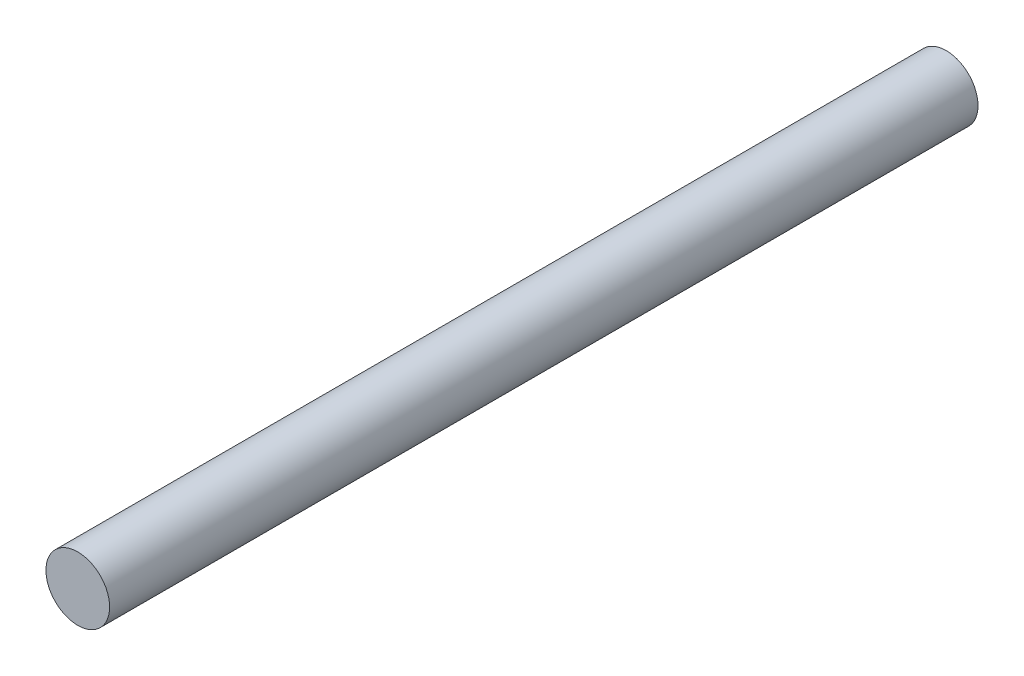
ISO-10303-21;
HEADER;
FILE_DESCRIPTION(('STEP AP214'),'2;1');
FILE_NAME('part.step','',(''),(''),'','','');
FILE_SCHEMA(('AUTOMOTIVE_DESIGN { 1 0 10303 214 1 1 1 1 }'));
ENDSEC;
DATA;
#1=APPLICATION_CONTEXT('core data for automotive mechanical design processes');
#2=APPLICATION_PROTOCOL_DEFINITION('international standard','automotive_design',2000,#1);
#3=PRODUCT_CONTEXT('',#1,'mechanical');
#4=PRODUCT('Part','Part','',(#3));
#5=PRODUCT_RELATED_PRODUCT_CATEGORY('part','',(#4));
#6=PRODUCT_DEFINITION_FORMATION('','',#4);
#7=PRODUCT_DEFINITION_CONTEXT('part definition',#1,'design');
#8=PRODUCT_DEFINITION('design','',#6,#7);
#9=PRODUCT_DEFINITION_SHAPE('','',#8);
#10=(LENGTH_UNIT() NAMED_UNIT(*) SI_UNIT(.MILLI.,.METRE.));
#11=(NAMED_UNIT(*) PLANE_ANGLE_UNIT() SI_UNIT($,.RADIAN.));
#12=(NAMED_UNIT(*) SI_UNIT($,.STERADIAN.) SOLID_ANGLE_UNIT());
#13=UNCERTAINTY_MEASURE_WITH_UNIT(LENGTH_MEASURE(1.E-05),#10,'distance_accuracy_value','');
#14=(GEOMETRIC_REPRESENTATION_CONTEXT(3) GLOBAL_UNCERTAINTY_ASSIGNED_CONTEXT((#13)) GLOBAL_UNIT_ASSIGNED_CONTEXT((#10,
#11,#12)) REPRESENTATION_CONTEXT('',''));
#15=CARTESIAN_POINT('',(0.,0.,0.));
#16=DIRECTION('',(0.,0.,1.));
#17=DIRECTION('',(1.,0.,0.));
#18=AXIS2_PLACEMENT_3D('',#15,#16,#17);
#19=CARTESIAN_POINT('',(0.,0.,-345.));
#20=DIRECTION('',(0.,0.,1.));
#21=DIRECTION('',(1.,0.,0.));
#22=AXIS2_PLACEMENT_3D('',#19,#20,#21);
#23=CYLINDRICAL_SURFACE('',#22,12.65);
#24=CARTESIAN_POINT('',(0.,0.,-345.));
#25=DIRECTION('',(0.,0.,1.));
#26=DIRECTION('',(1.,0.,0.));
#27=AXIS2_PLACEMENT_3D('',#24,#25,#26);
#28=CIRCLE('',#27,12.65);
#29=CARTESIAN_POINT('',(12.65,0.,-345.));
#30=VERTEX_POINT('',#29);
#31=EDGE_CURVE('E10',#30,#30,#28,.T.);
#32=ORIENTED_EDGE('',*,*,#31,.T.);
#33=EDGE_LOOP('',(#32));
#34=FACE_BOUND('',#33,.T.);
#35=CARTESIAN_POINT('',(0.,0.,0.));
#36=DIRECTION('',(0.,0.,1.));
#37=DIRECTION('',(1.,0.,0.));
#38=AXIS2_PLACEMENT_3D('',#35,#36,#37);
#39=CIRCLE('',#38,12.65);
#40=CARTESIAN_POINT('',(12.65,0.,0.));
#41=VERTEX_POINT('',#40);
#42=EDGE_CURVE('E36',#41,#41,#39,.T.);
#43=ORIENTED_EDGE('',*,*,#42,.F.);
#44=EDGE_LOOP('',(#43));
#45=FACE_BOUND('',#44,.T.);
#46=ADVANCED_FACE('F33',(#34,#45),#23,.T.);
#47=CARTESIAN_POINT('',(0.,0.,-345.));
#48=DIRECTION('',(0.,0.,1.));
#49=DIRECTION('',(1.,0.,0.));
#50=AXIS2_PLACEMENT_3D('',#47,#48,#49);
#51=PLANE('',#50);
#52=ORIENTED_EDGE('',*,*,#31,.F.);
#53=EDGE_LOOP('',(#52));
#54=FACE_BOUND('',#53,.T.);
#55=ADVANCED_FACE('F48',(#54),#51,.F.);
#56=CARTESIAN_POINT('',(0.,0.,0.));
#57=DIRECTION('',(0.,0.,1.));
#58=DIRECTION('',(1.,0.,0.));
#59=AXIS2_PLACEMENT_3D('',#56,#57,#58);
#60=PLANE('',#59);
#61=ORIENTED_EDGE('',*,*,#42,.T.);
#62=EDGE_LOOP('',(#61));
#63=FACE_BOUND('',#62,.T.);
#64=ADVANCED_FACE('F45',(#63),#60,.T.);
#65=CLOSED_SHELL('',(#46,#55,#64));
#66=MANIFOLD_SOLID_BREP('B2',#65);
#67=ADVANCED_BREP_SHAPE_REPRESENTATION('',(#18,#66),#14);
#68=SHAPE_DEFINITION_REPRESENTATION(#9,#67);
ENDSEC;
END-ISO-10303-21;
